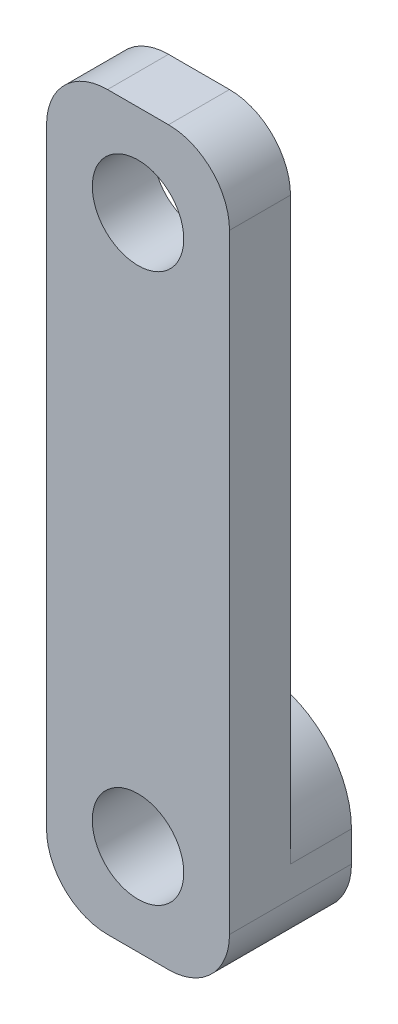
ISO-10303-21;
HEADER;
FILE_DESCRIPTION(('STEP AP214'),'2;1');
FILE_NAME('part.step','',(''),(''),'','','');
FILE_SCHEMA(('AUTOMOTIVE_DESIGN { 1 0 10303 214 1 1 1 1 }'));
ENDSEC;
DATA;
#1=APPLICATION_CONTEXT('core data for automotive mechanical design processes');
#2=APPLICATION_PROTOCOL_DEFINITION('international standard','automotive_design',2000,#1);
#3=PRODUCT_CONTEXT('',#1,'mechanical');
#4=PRODUCT('Part','Part','',(#3));
#5=PRODUCT_RELATED_PRODUCT_CATEGORY('part','',(#4));
#6=PRODUCT_DEFINITION_FORMATION('','',#4);
#7=PRODUCT_DEFINITION_CONTEXT('part definition',#1,'design');
#8=PRODUCT_DEFINITION('design','',#6,#7);
#9=PRODUCT_DEFINITION_SHAPE('','',#8);
#10=(LENGTH_UNIT() NAMED_UNIT(*) SI_UNIT(.MILLI.,.METRE.));
#11=(NAMED_UNIT(*) PLANE_ANGLE_UNIT() SI_UNIT($,.RADIAN.));
#12=(NAMED_UNIT(*) SI_UNIT($,.STERADIAN.) SOLID_ANGLE_UNIT());
#13=UNCERTAINTY_MEASURE_WITH_UNIT(LENGTH_MEASURE(1.E-05),#10,'distance_accuracy_value','');
#14=(GEOMETRIC_REPRESENTATION_CONTEXT(3) GLOBAL_UNCERTAINTY_ASSIGNED_CONTEXT((#13)) GLOBAL_UNIT_ASSIGNED_CONTEXT((#10,
#11,#12)) REPRESENTATION_CONTEXT('',''));
#15=CARTESIAN_POINT('',(0.,0.,0.));
#16=DIRECTION('',(0.,0.,1.));
#17=DIRECTION('',(1.,0.,0.));
#18=AXIS2_PLACEMENT_3D('',#15,#16,#17);
#19=CARTESIAN_POINT('',(0.,0.,2.));
#20=DIRECTION('',(0.,0.,-1.));
#21=DIRECTION('',(-1.,0.,0.));
#22=AXIS2_PLACEMENT_3D('',#19,#20,#21);
#23=PLANE('',#22);
#24=DIRECTION('',(0.,-1.,0.));
#25=VECTOR('',#24,1.);
#26=CARTESIAN_POINT('',(-3.,-12.,2.));
#27=LINE('',#26,#25);
#28=CARTESIAN_POINT('',(-3.,10.,2.));
#29=VERTEX_POINT('',#28);
#30=CARTESIAN_POINT('',(-3.,-10.,2.));
#31=VERTEX_POINT('',#30);
#32=EDGE_CURVE('E158',#29,#31,#27,.T.);
#33=ORIENTED_EDGE('',*,*,#32,.T.);
#34=CARTESIAN_POINT('',(-1.,-10.,2.));
#35=DIRECTION('',(0.,0.,-1.));
#36=DIRECTION('',(-1.,0.,0.));
#37=AXIS2_PLACEMENT_3D('',#34,#35,#36);
#38=CIRCLE('',#37,2.);
#39=CARTESIAN_POINT('',(-1.,-12.,2.));
#40=VERTEX_POINT('',#39);
#41=EDGE_CURVE('E188',#31,#40,#38,.F.);
#42=ORIENTED_EDGE('',*,*,#41,.T.);
#43=DIRECTION('',(1.,0.,0.));
#44=VECTOR('',#43,1.);
#45=CARTESIAN_POINT('',(-3.,-12.,2.));
#46=LINE('',#45,#44);
#47=CARTESIAN_POINT('',(1.,-12.,2.));
#48=VERTEX_POINT('',#47);
#49=EDGE_CURVE('E161',#40,#48,#46,.T.);
#50=ORIENTED_EDGE('',*,*,#49,.T.);
#51=CARTESIAN_POINT('',(1.,-10.,2.));
#52=DIRECTION('',(0.,0.,-1.));
#53=DIRECTION('',(-1.,0.,0.));
#54=AXIS2_PLACEMENT_3D('',#51,#52,#53);
#55=CIRCLE('',#54,2.);
#56=CARTESIAN_POINT('',(3.,-10.,2.));
#57=VERTEX_POINT('',#56);
#58=EDGE_CURVE('E186',#48,#57,#55,.F.);
#59=ORIENTED_EDGE('',*,*,#58,.T.);
#60=DIRECTION('',(0.,1.,0.));
#61=VECTOR('',#60,1.);
#62=CARTESIAN_POINT('',(3.,-12.,2.));
#63=LINE('',#62,#61);
#64=CARTESIAN_POINT('',(3.,10.,2.));
#65=VERTEX_POINT('',#64);
#66=EDGE_CURVE('E152',#57,#65,#63,.T.);
#67=ORIENTED_EDGE('',*,*,#66,.T.);
#68=CARTESIAN_POINT('',(1.,10.,2.));
#69=DIRECTION('',(0.,0.,-1.));
#70=DIRECTION('',(-1.,0.,0.));
#71=AXIS2_PLACEMENT_3D('',#68,#69,#70);
#72=CIRCLE('',#71,2.);
#73=CARTESIAN_POINT('',(1.,12.,2.));
#74=VERTEX_POINT('',#73);
#75=EDGE_CURVE('E182',#65,#74,#72,.F.);
#76=ORIENTED_EDGE('',*,*,#75,.T.);
#77=DIRECTION('',(-1.,0.,0.));
#78=VECTOR('',#77,1.);
#79=CARTESIAN_POINT('',(-3.,12.,2.));
#80=LINE('',#79,#78);
#81=CARTESIAN_POINT('',(-1.,12.,2.));
#82=VERTEX_POINT('',#81);
#83=EDGE_CURVE('E155',#74,#82,#80,.T.);
#84=ORIENTED_EDGE('',*,*,#83,.T.);
#85=CARTESIAN_POINT('',(-1.,10.,2.));
#86=DIRECTION('',(0.,0.,-1.));
#87=DIRECTION('',(-1.,0.,0.));
#88=AXIS2_PLACEMENT_3D('',#85,#86,#87);
#89=CIRCLE('',#88,2.);
#90=EDGE_CURVE('E184',#82,#29,#89,.F.);
#91=ORIENTED_EDGE('',*,*,#90,.T.);
#92=EDGE_LOOP('',(#33,#42,#50,#59,#67,#76,#84,#91));
#93=FACE_BOUND('',#92,.T.);
#94=CARTESIAN_POINT('',(0.,9.,2.));
#95=DIRECTION('',(0.,0.,1.));
#96=DIRECTION('',(1.,0.,0.));
#97=AXIS2_PLACEMENT_3D('',#94,#95,#96);
#98=CIRCLE('',#97,1.5);
#99=CARTESIAN_POINT('',(1.5,9.,2.));
#100=VERTEX_POINT('',#99);
#101=EDGE_CURVE('E146',#100,#100,#98,.T.);
#102=ORIENTED_EDGE('',*,*,#101,.F.);
#103=EDGE_LOOP('',(#102));
#104=FACE_BOUND('',#103,.T.);
#105=CARTESIAN_POINT('',(0.,-9.,2.));
#106=DIRECTION('',(0.,0.,1.));
#107=DIRECTION('',(1.,0.,0.));
#108=AXIS2_PLACEMENT_3D('',#105,#106,#107);
#109=CIRCLE('',#108,1.5);
#110=CARTESIAN_POINT('',(1.5,-9.,2.));
#111=VERTEX_POINT('',#110);
#112=EDGE_CURVE('E137',#111,#111,#109,.T.);
#113=ORIENTED_EDGE('',*,*,#112,.F.);
#114=EDGE_LOOP('',(#113));
#115=FACE_BOUND('',#114,.T.);
#116=ADVANCED_FACE('F34',(#93,#104,#115),#23,.F.);
#117=CARTESIAN_POINT('',(0.,0.,0.));
#118=DIRECTION('',(0.,0.,-1.));
#119=DIRECTION('',(-1.,0.,0.));
#120=AXIS2_PLACEMENT_3D('',#117,#118,#119);
#121=PLANE('',#120);
#122=CARTESIAN_POINT('',(0.,-9.,0.));
#123=DIRECTION('',(0.,0.,-1.));
#124=DIRECTION('',(-1.,0.,0.));
#125=AXIS2_PLACEMENT_3D('',#122,#123,#124);
#126=CIRCLE('',#125,3.);
#127=CARTESIAN_POINT('',(-3.,-9.,0.));
#128=VERTEX_POINT('',#127);
#129=CARTESIAN_POINT('',(3.,-9.,0.));
#130=VERTEX_POINT('',#129);
#131=EDGE_CURVE('E49',#128,#130,#126,.T.);
#132=ORIENTED_EDGE('',*,*,#131,.F.);
#133=DIRECTION('',(0.,-1.,0.));
#134=VECTOR('',#133,1.);
#135=CARTESIAN_POINT('',(-3.,-12.,0.));
#136=LINE('',#135,#134);
#137=CARTESIAN_POINT('',(-3.,10.,0.));
#138=VERTEX_POINT('',#137);
#139=EDGE_CURVE('E156',#138,#128,#136,.T.);
#140=ORIENTED_EDGE('',*,*,#139,.F.);
#141=CARTESIAN_POINT('',(-1.,10.,0.));
#142=DIRECTION('',(0.,0.,-1.));
#143=DIRECTION('',(-1.,0.,0.));
#144=AXIS2_PLACEMENT_3D('',#141,#142,#143);
#145=CIRCLE('',#144,2.);
#146=CARTESIAN_POINT('',(-1.,12.,0.));
#147=VERTEX_POINT('',#146);
#148=EDGE_CURVE('E175',#138,#147,#145,.T.);
#149=ORIENTED_EDGE('',*,*,#148,.T.);
#150=DIRECTION('',(-1.,0.,0.));
#151=VECTOR('',#150,1.);
#152=CARTESIAN_POINT('',(-3.,12.,0.));
#153=LINE('',#152,#151);
#154=CARTESIAN_POINT('',(1.,12.,0.));
#155=VERTEX_POINT('',#154);
#156=EDGE_CURVE('E166',#155,#147,#153,.T.);
#157=ORIENTED_EDGE('',*,*,#156,.F.);
#158=CARTESIAN_POINT('',(1.,10.,0.));
#159=DIRECTION('',(0.,0.,-1.));
#160=DIRECTION('',(-1.,0.,0.));
#161=AXIS2_PLACEMENT_3D('',#158,#159,#160);
#162=CIRCLE('',#161,2.);
#163=CARTESIAN_POINT('',(3.,10.,0.));
#164=VERTEX_POINT('',#163);
#165=EDGE_CURVE('E172',#155,#164,#162,.T.);
#166=ORIENTED_EDGE('',*,*,#165,.T.);
#167=DIRECTION('',(0.,1.,0.));
#168=VECTOR('',#167,1.);
#169=CARTESIAN_POINT('',(3.,-12.,0.));
#170=LINE('',#169,#168);
#171=EDGE_CURVE('E149',#130,#164,#170,.T.);
#172=ORIENTED_EDGE('',*,*,#171,.F.);
#173=EDGE_LOOP('',(#132,#140,#149,#157,#166,#172));
#174=FACE_BOUND('',#173,.T.);
#175=CARTESIAN_POINT('',(0.,9.,0.));
#176=DIRECTION('',(0.,0.,1.));
#177=DIRECTION('',(1.,0.,0.));
#178=AXIS2_PLACEMENT_3D('',#175,#176,#177);
#179=CIRCLE('',#178,1.5);
#180=CARTESIAN_POINT('',(1.5,9.,0.));
#181=VERTEX_POINT('',#180);
#182=EDGE_CURVE('E141',#181,#181,#179,.T.);
#183=ORIENTED_EDGE('',*,*,#182,.T.);
#184=EDGE_LOOP('',(#183));
#185=FACE_BOUND('',#184,.T.);
#186=ADVANCED_FACE('F198',(#174,#185),#121,.T.);
#187=CARTESIAN_POINT('',(3.,-12.,2.));
#188=DIRECTION('',(-1.,0.,0.));
#189=DIRECTION('',(0.,0.,1.));
#190=AXIS2_PLACEMENT_3D('',#187,#188,#189);
#191=PLANE('',#190);
#192=ORIENTED_EDGE('',*,*,#66,.F.);
#193=DIRECTION('',(0.,0.,-1.));
#194=VECTOR('',#193,1.);
#195=CARTESIAN_POINT('',(3.,-10.,2.));
#196=LINE('',#195,#194);
#197=CARTESIAN_POINT('',(3.,-10.,-2.));
#198=VERTEX_POINT('',#197);
#199=EDGE_CURVE('E119',#57,#198,#196,.T.);
#200=ORIENTED_EDGE('',*,*,#199,.T.);
#201=DIRECTION('',(0.,-1.,0.));
#202=VECTOR('',#201,1.);
#203=CARTESIAN_POINT('',(3.,0.,-2.));
#204=LINE('',#203,#202);
#205=CARTESIAN_POINT('',(3.,-9.,-2.));
#206=VERTEX_POINT('',#205);
#207=EDGE_CURVE('E112',#206,#198,#204,.T.);
#208=ORIENTED_EDGE('',*,*,#207,.F.);
#209=DIRECTION('',(0.,0.,1.));
#210=VECTOR('',#209,1.);
#211=CARTESIAN_POINT('',(3.,-9.,-2.));
#212=LINE('',#211,#210);
#213=EDGE_CURVE('E117',#206,#130,#212,.T.);
#214=ORIENTED_EDGE('',*,*,#213,.T.);
#215=ORIENTED_EDGE('',*,*,#171,.T.);
#216=DIRECTION('',(0.,0.,-1.));
#217=VECTOR('',#216,1.);
#218=CARTESIAN_POINT('',(3.,10.,2.));
#219=LINE('',#218,#217);
#220=EDGE_CURVE('E190',#164,#65,#219,.F.);
#221=ORIENTED_EDGE('',*,*,#220,.T.);
#222=EDGE_LOOP('',(#192,#200,#208,#214,#215,#221));
#223=FACE_BOUND('',#222,.T.);
#224=ADVANCED_FACE('F115',(#223),#191,.F.);
#225=CARTESIAN_POINT('',(-3.,12.,2.));
#226=DIRECTION('',(0.,-1.,0.));
#227=DIRECTION('',(1.,0.,0.));
#228=AXIS2_PLACEMENT_3D('',#225,#226,#227);
#229=PLANE('',#228);
#230=ORIENTED_EDGE('',*,*,#156,.T.);
#231=DIRECTION('',(0.,0.,-1.));
#232=VECTOR('',#231,1.);
#233=CARTESIAN_POINT('',(-1.,12.,2.));
#234=LINE('',#233,#232);
#235=EDGE_CURVE('E11',#147,#82,#234,.F.);
#236=ORIENTED_EDGE('',*,*,#235,.T.);
#237=ORIENTED_EDGE('',*,*,#83,.F.);
#238=DIRECTION('',(0.,0.,-1.));
#239=VECTOR('',#238,1.);
#240=CARTESIAN_POINT('',(1.,12.,2.));
#241=LINE('',#240,#239);
#242=EDGE_CURVE('E42',#74,#155,#241,.T.);
#243=ORIENTED_EDGE('',*,*,#242,.T.);
#244=EDGE_LOOP('',(#230,#236,#237,#243));
#245=FACE_BOUND('',#244,.T.);
#246=ADVANCED_FACE('F195',(#245),#229,.F.);
#247=CARTESIAN_POINT('',(-3.,-12.,2.));
#248=DIRECTION('',(1.,0.,0.));
#249=DIRECTION('',(0.,0.,-1.));
#250=AXIS2_PLACEMENT_3D('',#247,#248,#249);
#251=PLANE('',#250);
#252=ORIENTED_EDGE('',*,*,#139,.T.);
#253=DIRECTION('',(0.,0.,1.));
#254=VECTOR('',#253,1.);
#255=CARTESIAN_POINT('',(-3.,-9.,-2.));
#256=LINE('',#255,#254);
#257=CARTESIAN_POINT('',(-3.,-9.,-2.));
#258=VERTEX_POINT('',#257);
#259=EDGE_CURVE('E138',#258,#128,#256,.T.);
#260=ORIENTED_EDGE('',*,*,#259,.F.);
#261=DIRECTION('',(0.,1.,0.));
#262=VECTOR('',#261,1.);
#263=CARTESIAN_POINT('',(-3.,0.,-2.));
#264=LINE('',#263,#262);
#265=CARTESIAN_POINT('',(-3.,-10.,-2.));
#266=VERTEX_POINT('',#265);
#267=EDGE_CURVE('E130',#266,#258,#264,.T.);
#268=ORIENTED_EDGE('',*,*,#267,.F.);
#269=DIRECTION('',(0.,0.,-1.));
#270=VECTOR('',#269,1.);
#271=CARTESIAN_POINT('',(-3.,-10.,2.));
#272=LINE('',#271,#270);
#273=EDGE_CURVE('E180',#266,#31,#272,.F.);
#274=ORIENTED_EDGE('',*,*,#273,.T.);
#275=ORIENTED_EDGE('',*,*,#32,.F.);
#276=DIRECTION('',(0.,0.,-1.));
#277=VECTOR('',#276,1.);
#278=CARTESIAN_POINT('',(-3.,10.,2.));
#279=LINE('',#278,#277);
#280=EDGE_CURVE('E177',#29,#138,#279,.T.);
#281=ORIENTED_EDGE('',*,*,#280,.T.);
#282=EDGE_LOOP('',(#252,#260,#268,#274,#275,#281));
#283=FACE_BOUND('',#282,.T.);
#284=ADVANCED_FACE('F207',(#283),#251,.F.);
#285=CARTESIAN_POINT('',(-3.,-12.,2.));
#286=DIRECTION('',(0.,1.,0.));
#287=DIRECTION('',(0.,0.,1.));
#288=AXIS2_PLACEMENT_3D('',#285,#286,#287);
#289=PLANE('',#288);
#290=ORIENTED_EDGE('',*,*,#49,.F.);
#291=DIRECTION('',(0.,0.,-1.));
#292=VECTOR('',#291,1.);
#293=CARTESIAN_POINT('',(-1.,-12.,2.));
#294=LINE('',#293,#292);
#295=CARTESIAN_POINT('',(-1.,-12.,-2.));
#296=VERTEX_POINT('',#295);
#297=EDGE_CURVE('E170',#40,#296,#294,.T.);
#298=ORIENTED_EDGE('',*,*,#297,.T.);
#299=DIRECTION('',(-1.,0.,0.));
#300=VECTOR('',#299,1.);
#301=CARTESIAN_POINT('',(0.,-12.,-2.));
#302=LINE('',#301,#300);
#303=CARTESIAN_POINT('',(1.,-12.,-2.));
#304=VERTEX_POINT('',#303);
#305=EDGE_CURVE('E221',#304,#296,#302,.T.);
#306=ORIENTED_EDGE('',*,*,#305,.F.);
#307=DIRECTION('',(0.,0.,-1.));
#308=VECTOR('',#307,1.);
#309=CARTESIAN_POINT('',(1.,-12.,2.));
#310=LINE('',#309,#308);
#311=EDGE_CURVE('E164',#304,#48,#310,.F.);
#312=ORIENTED_EDGE('',*,*,#311,.T.);
#313=EDGE_LOOP('',(#290,#298,#306,#312));
#314=FACE_BOUND('',#313,.T.);
#315=ADVANCED_FACE('F220',(#314),#289,.F.);
#316=CARTESIAN_POINT('',(0.,9.,2.));
#317=DIRECTION('',(0.,0.,-1.));
#318=DIRECTION('',(-1.,0.,0.));
#319=AXIS2_PLACEMENT_3D('',#316,#317,#318);
#320=CYLINDRICAL_SURFACE('',#319,1.5);
#321=ORIENTED_EDGE('',*,*,#101,.T.);
#322=EDGE_LOOP('',(#321));
#323=FACE_BOUND('',#322,.T.);
#324=ORIENTED_EDGE('',*,*,#182,.F.);
#325=EDGE_LOOP('',(#324));
#326=FACE_BOUND('',#325,.T.);
#327=ADVANCED_FACE('F233',(#323,#326),#320,.F.);
#328=CARTESIAN_POINT('',(0.,-9.,2.));
#329=DIRECTION('',(0.,0.,-1.));
#330=DIRECTION('',(-1.,0.,0.));
#331=AXIS2_PLACEMENT_3D('',#328,#329,#330);
#332=CYLINDRICAL_SURFACE('',#331,1.5);
#333=ORIENTED_EDGE('',*,*,#112,.T.);
#334=EDGE_LOOP('',(#333));
#335=FACE_BOUND('',#334,.T.);
#336=CARTESIAN_POINT('',(0.,-9.,-2.));
#337=DIRECTION('',(0.,0.,-1.));
#338=DIRECTION('',(-1.,0.,0.));
#339=AXIS2_PLACEMENT_3D('',#336,#337,#338);
#340=CIRCLE('',#339,1.5);
#341=CARTESIAN_POINT('',(-1.5,-9.,-2.));
#342=VERTEX_POINT('',#341);
#343=EDGE_CURVE('E134',#342,#342,#340,.F.);
#344=ORIENTED_EDGE('',*,*,#343,.F.);
#345=EDGE_LOOP('',(#344));
#346=FACE_BOUND('',#345,.T.);
#347=ADVANCED_FACE('F231',(#335,#346),#332,.F.);
#348=CARTESIAN_POINT('',(-1.,-10.,2.));
#349=DIRECTION('',(0.,0.,-1.));
#350=DIRECTION('',(-1.,0.,0.));
#351=AXIS2_PLACEMENT_3D('',#348,#349,#350);
#352=CYLINDRICAL_SURFACE('',#351,2.);
#353=ORIENTED_EDGE('',*,*,#41,.F.);
#354=ORIENTED_EDGE('',*,*,#273,.F.);
#355=CARTESIAN_POINT('',(-1.,-10.,-2.));
#356=DIRECTION('',(0.,0.,-1.));
#357=DIRECTION('',(-1.,0.,0.));
#358=AXIS2_PLACEMENT_3D('',#355,#356,#357);
#359=CIRCLE('',#358,2.);
#360=EDGE_CURVE('E216',#296,#266,#359,.T.);
#361=ORIENTED_EDGE('',*,*,#360,.F.);
#362=ORIENTED_EDGE('',*,*,#297,.F.);
#363=EDGE_LOOP('',(#353,#354,#361,#362));
#364=FACE_BOUND('',#363,.T.);
#365=ADVANCED_FACE('F214',(#364),#352,.T.);
#366=CARTESIAN_POINT('',(1.,-10.,2.));
#367=DIRECTION('',(0.,0.,-1.));
#368=DIRECTION('',(-1.,0.,0.));
#369=AXIS2_PLACEMENT_3D('',#366,#367,#368);
#370=CYLINDRICAL_SURFACE('',#369,2.);
#371=ORIENTED_EDGE('',*,*,#58,.F.);
#372=ORIENTED_EDGE('',*,*,#311,.F.);
#373=CARTESIAN_POINT('',(1.,-10.,-2.));
#374=DIRECTION('',(0.,0.,-1.));
#375=DIRECTION('',(-1.,0.,0.));
#376=AXIS2_PLACEMENT_3D('',#373,#374,#375);
#377=CIRCLE('',#376,2.);
#378=EDGE_CURVE('E123',#198,#304,#377,.T.);
#379=ORIENTED_EDGE('',*,*,#378,.F.);
#380=ORIENTED_EDGE('',*,*,#199,.F.);
#381=EDGE_LOOP('',(#371,#372,#379,#380));
#382=FACE_BOUND('',#381,.T.);
#383=ADVANCED_FACE('F240',(#382),#370,.T.);
#384=CARTESIAN_POINT('',(-1.,10.,2.));
#385=DIRECTION('',(0.,0.,-1.));
#386=DIRECTION('',(-1.,0.,0.));
#387=AXIS2_PLACEMENT_3D('',#384,#385,#386);
#388=CYLINDRICAL_SURFACE('',#387,2.);
#389=ORIENTED_EDGE('',*,*,#90,.F.);
#390=ORIENTED_EDGE('',*,*,#235,.F.);
#391=ORIENTED_EDGE('',*,*,#148,.F.);
#392=ORIENTED_EDGE('',*,*,#280,.F.);
#393=EDGE_LOOP('',(#389,#390,#391,#392));
#394=FACE_BOUND('',#393,.T.);
#395=ADVANCED_FACE('F204',(#394),#388,.T.);
#396=CARTESIAN_POINT('',(1.,10.,2.));
#397=DIRECTION('',(0.,0.,-1.));
#398=DIRECTION('',(-1.,0.,0.));
#399=AXIS2_PLACEMENT_3D('',#396,#397,#398);
#400=CYLINDRICAL_SURFACE('',#399,2.);
#401=ORIENTED_EDGE('',*,*,#75,.F.);
#402=ORIENTED_EDGE('',*,*,#220,.F.);
#403=ORIENTED_EDGE('',*,*,#165,.F.);
#404=ORIENTED_EDGE('',*,*,#242,.F.);
#405=EDGE_LOOP('',(#401,#402,#403,#404));
#406=FACE_BOUND('',#405,.T.);
#407=ADVANCED_FACE('F36',(#406),#400,.T.);
#408=CARTESIAN_POINT('',(0.,-9.,-2.));
#409=DIRECTION('',(0.,0.,1.));
#410=DIRECTION('',(1.,0.,0.));
#411=AXIS2_PLACEMENT_3D('',#408,#409,#410);
#412=CYLINDRICAL_SURFACE('',#411,3.);
#413=ORIENTED_EDGE('',*,*,#131,.T.);
#414=ORIENTED_EDGE('',*,*,#213,.F.);
#415=CARTESIAN_POINT('',(0.,-9.,-2.));
#416=DIRECTION('',(0.,0.,-1.));
#417=DIRECTION('',(-1.,0.,0.));
#418=AXIS2_PLACEMENT_3D('',#415,#416,#417);
#419=CIRCLE('',#418,3.);
#420=EDGE_CURVE('E124',#258,#206,#419,.T.);
#421=ORIENTED_EDGE('',*,*,#420,.F.);
#422=ORIENTED_EDGE('',*,*,#259,.T.);
#423=EDGE_LOOP('',(#413,#414,#421,#422));
#424=FACE_BOUND('',#423,.T.);
#425=ADVANCED_FACE('F136',(#424),#412,.T.);
#426=CARTESIAN_POINT('',(0.,0.,-2.));
#427=DIRECTION('',(0.,0.,-1.));
#428=DIRECTION('',(-1.,0.,0.));
#429=AXIS2_PLACEMENT_3D('',#426,#427,#428);
#430=PLANE('',#429);
#431=ORIENTED_EDGE('',*,*,#343,.T.);
#432=EDGE_LOOP('',(#431));
#433=FACE_BOUND('',#432,.T.);
#434=ORIENTED_EDGE('',*,*,#420,.T.);
#435=ORIENTED_EDGE('',*,*,#207,.T.);
#436=ORIENTED_EDGE('',*,*,#378,.T.);
#437=ORIENTED_EDGE('',*,*,#305,.T.);
#438=ORIENTED_EDGE('',*,*,#360,.T.);
#439=ORIENTED_EDGE('',*,*,#267,.T.);
#440=EDGE_LOOP('',(#434,#435,#436,#437,#438,#439));
#441=FACE_BOUND('',#440,.T.);
#442=ADVANCED_FACE('F127',(#433,#441),#430,.T.);
#443=CLOSED_SHELL('',(#116,#186,#224,#246,#284,#315,#327,#347,#365,#383,#395,#407,#425,#442));
#444=MANIFOLD_SOLID_BREP('B2',#443);
#445=ADVANCED_BREP_SHAPE_REPRESENTATION('',(#18,#444),#14);
#446=SHAPE_DEFINITION_REPRESENTATION(#9,#445);
ENDSEC;
END-ISO-10303-21;
